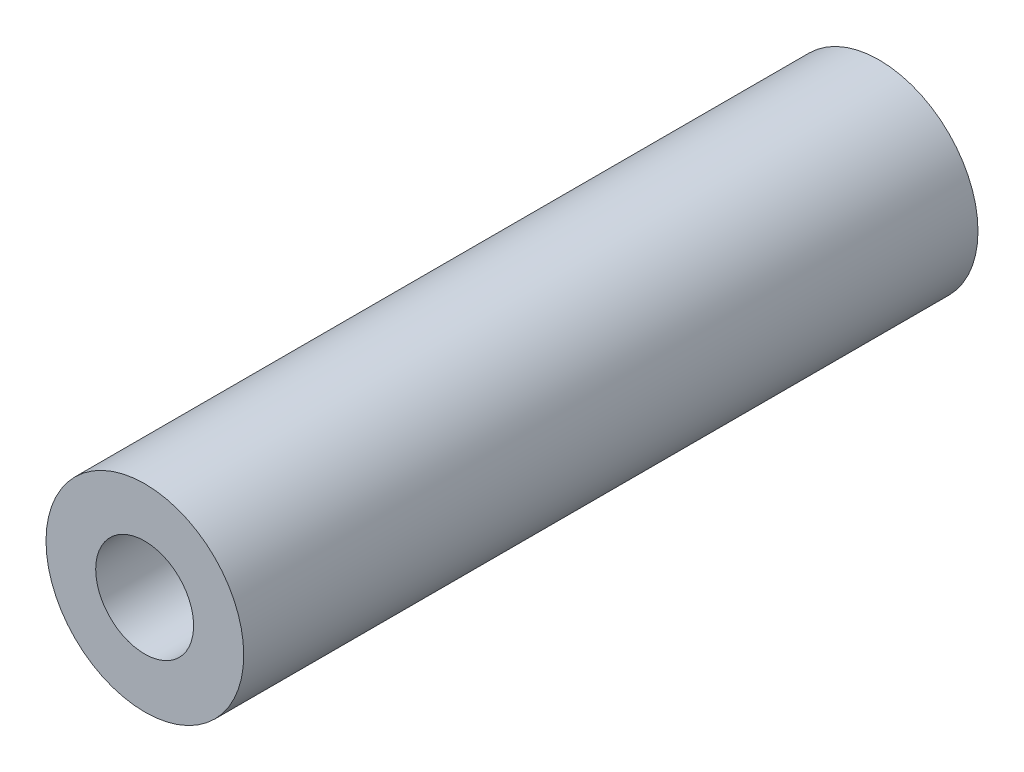
ISO-10303-21;
HEADER;
FILE_DESCRIPTION(('STEP AP214'),'2;1');
FILE_NAME('part.step','',(''),(''),'','','');
FILE_SCHEMA(('AUTOMOTIVE_DESIGN { 1 0 10303 214 1 1 1 1 }'));
ENDSEC;
DATA;
#1=APPLICATION_CONTEXT('core data for automotive mechanical design processes');
#2=APPLICATION_PROTOCOL_DEFINITION('international standard','automotive_design',2000,#1);
#3=PRODUCT_CONTEXT('',#1,'mechanical');
#4=PRODUCT('Part','Part','',(#3));
#5=PRODUCT_RELATED_PRODUCT_CATEGORY('part','',(#4));
#6=PRODUCT_DEFINITION_FORMATION('','',#4);
#7=PRODUCT_DEFINITION_CONTEXT('part definition',#1,'design');
#8=PRODUCT_DEFINITION('design','',#6,#7);
#9=PRODUCT_DEFINITION_SHAPE('','',#8);
#10=(LENGTH_UNIT() NAMED_UNIT(*) SI_UNIT(.MILLI.,.METRE.));
#11=(NAMED_UNIT(*) PLANE_ANGLE_UNIT() SI_UNIT($,.RADIAN.));
#12=(NAMED_UNIT(*) SI_UNIT($,.STERADIAN.) SOLID_ANGLE_UNIT());
#13=UNCERTAINTY_MEASURE_WITH_UNIT(LENGTH_MEASURE(1.E-05),#10,'distance_accuracy_value','');
#14=(GEOMETRIC_REPRESENTATION_CONTEXT(3) GLOBAL_UNCERTAINTY_ASSIGNED_CONTEXT((#13)) GLOBAL_UNIT_ASSIGNED_CONTEXT((#10,
#11,#12)) REPRESENTATION_CONTEXT('',''));
#15=CARTESIAN_POINT('',(0.,0.,0.));
#16=DIRECTION('',(0.,0.,1.));
#17=DIRECTION('',(1.,0.,0.));
#18=AXIS2_PLACEMENT_3D('',#15,#16,#17);
#19=CARTESIAN_POINT('',(-0.10940306159668,0.0577452115676953,45.));
#20=DIRECTION('',(0.,0.,1.));
#21=DIRECTION('',(1.,0.,0.));
#22=AXIS2_PLACEMENT_3D('',#19,#20,#21);
#23=PLANE('',#22);
#24=CARTESIAN_POINT('',(-0.10940306159668,0.0577452115676953,45.));
#25=DIRECTION('',(0.,0.,1.));
#26=DIRECTION('',(1.,0.,0.));
#27=AXIS2_PLACEMENT_3D('',#24,#25,#26);
#28=CIRCLE('',#27,6.05922744338173);
#29=CARTESIAN_POINT('',(-6.16863050497841,0.0577452115676953,45.));
#30=VERTEX_POINT('',#29);
#31=EDGE_CURVE('E10',#30,#30,#28,.T.);
#32=ORIENTED_EDGE('',*,*,#31,.T.);
#33=EDGE_LOOP('',(#32));
#34=FACE_BOUND('',#33,.T.);
#35=CARTESIAN_POINT('',(-0.123031064837464,0.076111171122141,45.));
#36=DIRECTION('',(0.,0.,1.));
#37=DIRECTION('',(1.,0.,0.));
#38=AXIS2_PLACEMENT_3D('',#35,#36,#37);
#39=CIRCLE('',#38,3.);
#40=CARTESIAN_POINT('',(-3.12303106483746,0.076111171122141,45.));
#41=VERTEX_POINT('',#40);
#42=EDGE_CURVE('E43',#41,#41,#39,.T.);
#43=ORIENTED_EDGE('',*,*,#42,.F.);
#44=EDGE_LOOP('',(#43));
#45=FACE_BOUND('',#44,.T.);
#46=ADVANCED_FACE('F32',(#34,#45),#23,.T.);
#47=CARTESIAN_POINT('',(-0.10940306159668,0.0577452115676953,0.));
#48=DIRECTION('',(0.,0.,1.));
#49=DIRECTION('',(1.,0.,0.));
#50=AXIS2_PLACEMENT_3D('',#47,#48,#49);
#51=PLANE('',#50);
#52=CARTESIAN_POINT('',(-0.10940306159668,0.0577452115676953,0.));
#53=DIRECTION('',(0.,0.,1.));
#54=DIRECTION('',(1.,0.,0.));
#55=AXIS2_PLACEMENT_3D('',#52,#53,#54);
#56=CIRCLE('',#55,6.05922744338173);
#57=CARTESIAN_POINT('',(-6.16863050497841,0.0577452115676953,0.));
#58=VERTEX_POINT('',#57);
#59=EDGE_CURVE('E36',#58,#58,#56,.T.);
#60=ORIENTED_EDGE('',*,*,#59,.F.);
#61=EDGE_LOOP('',(#60));
#62=FACE_BOUND('',#61,.T.);
#63=CARTESIAN_POINT('',(-0.123031064837464,0.076111171122141,0.));
#64=DIRECTION('',(0.,0.,1.));
#65=DIRECTION('',(1.,0.,0.));
#66=AXIS2_PLACEMENT_3D('',#63,#64,#65);
#67=CIRCLE('',#66,3.);
#68=CARTESIAN_POINT('',(-3.12303106483746,0.076111171122141,0.));
#69=VERTEX_POINT('',#68);
#70=EDGE_CURVE('E45',#69,#69,#67,.T.);
#71=ORIENTED_EDGE('',*,*,#70,.T.);
#72=EDGE_LOOP('',(#71));
#73=FACE_BOUND('',#72,.T.);
#74=ADVANCED_FACE('F55',(#62,#73),#51,.F.);
#75=CARTESIAN_POINT('',(-0.10940306159668,0.0577452115676953,45.));
#76=DIRECTION('',(0.,0.,-1.));
#77=DIRECTION('',(-1.,0.,0.));
#78=AXIS2_PLACEMENT_3D('',#75,#76,#77);
#79=CYLINDRICAL_SURFACE('',#78,6.05922744338173);
#80=CARTESIAN_POINT('',(-6.16863050497841,0.0577452115676953,45.));
#81=CARTESIAN_POINT('',(-6.16863050497841,0.0577452115676953,44.53125));
#82=CARTESIAN_POINT('',(-6.16863050497841,0.0577452115676953,44.0625));
#83=CARTESIAN_POINT('',(-6.16863050497841,0.0577452115676953,43.125));
#84=CARTESIAN_POINT('',(-6.16863050497841,0.0577452115676953,42.65625));
#85=CARTESIAN_POINT('',(-6.16863050497841,0.0577452115676953,41.71875));
#86=CARTESIAN_POINT('',(-6.16863050497841,0.0577452115676953,41.25));
#87=CARTESIAN_POINT('',(-6.16863050497841,0.0577452115676953,40.3125));
#88=CARTESIAN_POINT('',(-6.16863050497841,0.0577452115676953,39.84375));
#89=CARTESIAN_POINT('',(-6.16863050497841,0.0577452115676953,38.90625));
#90=CARTESIAN_POINT('',(-6.16863050497841,0.0577452115676953,38.4375));
#91=CARTESIAN_POINT('',(-6.16863050497841,0.0577452115676953,37.5));
#92=CARTESIAN_POINT('',(-6.16863050497841,0.0577452115676953,37.03125));
#93=CARTESIAN_POINT('',(-6.16863050497841,0.0577452115676953,36.09375));
#94=CARTESIAN_POINT('',(-6.16863050497841,0.0577452115676953,35.625));
#95=CARTESIAN_POINT('',(-6.16863050497841,0.0577452115676953,34.6875));
#96=CARTESIAN_POINT('',(-6.16863050497841,0.0577452115676953,34.21875));
#97=CARTESIAN_POINT('',(-6.16863050497841,0.0577452115676953,33.28125));
#98=CARTESIAN_POINT('',(-6.16863050497841,0.0577452115676953,32.8125));
#99=CARTESIAN_POINT('',(-6.16863050497841,0.0577452115676953,31.875));
#100=CARTESIAN_POINT('',(-6.16863050497841,0.0577452115676953,31.40625));
#101=CARTESIAN_POINT('',(-6.16863050497841,0.0577452115676953,30.46875));
#102=CARTESIAN_POINT('',(-6.16863050497841,0.0577452115676953,30.));
#103=CARTESIAN_POINT('',(-6.16863050497841,0.0577452115676953,29.0625));
#104=CARTESIAN_POINT('',(-6.16863050497841,0.0577452115676953,28.59375));
#105=CARTESIAN_POINT('',(-6.16863050497841,0.0577452115676953,27.65625));
#106=CARTESIAN_POINT('',(-6.16863050497841,0.0577452115676953,27.1875));
#107=CARTESIAN_POINT('',(-6.16863050497841,0.0577452115676953,26.25));
#108=CARTESIAN_POINT('',(-6.16863050497841,0.0577452115676953,25.78125));
#109=CARTESIAN_POINT('',(-6.16863050497841,0.0577452115676953,24.84375));
#110=CARTESIAN_POINT('',(-6.16863050497841,0.0577452115676953,24.375));
#111=CARTESIAN_POINT('',(-6.16863050497841,0.0577452115676953,23.4375));
#112=CARTESIAN_POINT('',(-6.16863050497841,0.0577452115676953,22.96875));
#113=CARTESIAN_POINT('',(-6.16863050497841,0.0577452115676953,22.03125));
#114=CARTESIAN_POINT('',(-6.16863050497841,0.0577452115676953,21.5625));
#115=CARTESIAN_POINT('',(-6.16863050497841,0.0577452115676953,20.625));
#116=CARTESIAN_POINT('',(-6.16863050497841,0.0577452115676953,20.15625));
#117=CARTESIAN_POINT('',(-6.16863050497841,0.0577452115676953,19.21875));
#118=CARTESIAN_POINT('',(-6.16863050497841,0.0577452115676953,18.75));
#119=CARTESIAN_POINT('',(-6.16863050497841,0.0577452115676953,17.8125));
#120=CARTESIAN_POINT('',(-6.16863050497841,0.0577452115676953,17.34375));
#121=CARTESIAN_POINT('',(-6.16863050497841,0.0577452115676953,16.40625));
#122=CARTESIAN_POINT('',(-6.16863050497841,0.0577452115676953,15.9375));
#123=CARTESIAN_POINT('',(-6.16863050497841,0.0577452115676953,15.));
#124=CARTESIAN_POINT('',(-6.16863050497841,0.0577452115676953,14.53125));
#125=CARTESIAN_POINT('',(-6.16863050497841,0.0577452115676953,13.59375));
#126=CARTESIAN_POINT('',(-6.16863050497841,0.0577452115676953,13.125));
#127=CARTESIAN_POINT('',(-6.16863050497841,0.0577452115676953,12.1875));
#128=CARTESIAN_POINT('',(-6.16863050497841,0.0577452115676953,11.71875));
#129=CARTESIAN_POINT('',(-6.16863050497841,0.0577452115676953,10.78125));
#130=CARTESIAN_POINT('',(-6.16863050497841,0.0577452115676953,10.3125));
#131=CARTESIAN_POINT('',(-6.16863050497841,0.0577452115676953,9.37499999999999));
#132=CARTESIAN_POINT('',(-6.16863050497841,0.0577452115676953,8.90624999999999));
#133=CARTESIAN_POINT('',(-6.16863050497841,0.0577452115676953,7.96874999999999));
#134=CARTESIAN_POINT('',(-6.16863050497841,0.0577452115676953,7.5));
#135=CARTESIAN_POINT('',(-6.16863050497841,0.0577452115676953,6.56249999999999));
#136=CARTESIAN_POINT('',(-6.16863050497841,0.0577452115676953,6.09374999999999));
#137=CARTESIAN_POINT('',(-6.16863050497841,0.0577452115676953,5.15624999999999));
#138=CARTESIAN_POINT('',(-6.16863050497841,0.0577452115676953,4.68749999999999));
#139=CARTESIAN_POINT('',(-6.16863050497841,0.0577452115676953,3.74999999999999));
#140=CARTESIAN_POINT('',(-6.16863050497841,0.0577452115676953,3.28124999999999));
#141=CARTESIAN_POINT('',(-6.16863050497841,0.0577452115676953,2.34374999999999));
#142=CARTESIAN_POINT('',(-6.16863050497841,0.0577452115676953,1.87499999999999));
#143=CARTESIAN_POINT('',(-6.16863050497841,0.0577452115676953,0.937499999999992));
#144=CARTESIAN_POINT('',(-6.16863050497841,0.0577452115676953,0.468749999999993));
#145=CARTESIAN_POINT('',(-6.16863050497841,0.0577452115676953,0.));
#146=B_SPLINE_CURVE_WITH_KNOTS('',3,(#80,#81,#82,#83,#84,#85,#86,#87,#88,#89,#90,#91,#92,#93,
#94,#95,#96,#97,#98,#99,#100,#101,#102,#103,#104,#105,#106,#107,#108,#109,#110,#111,#112,#113,
#114,#115,#116,#117,#118,#119,#120,#121,#122,#123,#124,#125,#126,#127,#128,#129,#130,#131,#132,
#133,#134,#135,#136,#137,#138,#139,#140,#141,#142,#143,#144,#145),.UNSPECIFIED.,.F.,.F.,(4,2,2,
2,2,2,2,2,2,2,2,2,2,2,2,2,2,2,2,2,2,2,2,2,2,2,2,2,2,2,2,2,4),(0.,1.40625,2.8125,
4.21874999999999,5.625,7.03125,8.43749999999999,9.84375,11.25,12.65625,14.0625,15.46875,16.875,
18.28125,19.6875,21.09375,22.5,23.90625,25.3125,26.71875,28.125,29.53125,30.9375,32.34375,33.75,
35.15625,36.5625,37.96875,39.375,40.78125,42.1875,43.59375,45.),.UNSPECIFIED.);
#147=EDGE_CURVE('BSEAM34',#30,#58,#146,.T.);
#148=ORIENTED_EDGE('',*,*,#31,.F.);
#149=ORIENTED_EDGE('',*,*,#59,.T.);
#150=ORIENTED_EDGE('',*,*,#147,.T.);
#151=ORIENTED_EDGE('',*,*,#147,.F.);
#152=EDGE_LOOP('',(#148,#150,#149,#151));
#153=FACE_BOUND('',#152,.T.);
#154=ADVANCED_FACE('F34',(#153),#79,.T.);
#155=CARTESIAN_POINT('',(-0.123031064837464,0.076111171122141,45.));
#156=DIRECTION('',(0.,0.,-1.));
#157=DIRECTION('',(-1.,0.,0.));
#158=AXIS2_PLACEMENT_3D('',#155,#156,#157);
#159=CYLINDRICAL_SURFACE('',#158,3.);
#160=CARTESIAN_POINT('',(-3.12303106483746,0.076111171122141,45.));
#161=CARTESIAN_POINT('',(-3.12303106483746,0.076111171122141,44.53125));
#162=CARTESIAN_POINT('',(-3.12303106483746,0.076111171122141,44.0625));
#163=CARTESIAN_POINT('',(-3.12303106483746,0.076111171122141,43.125));
#164=CARTESIAN_POINT('',(-3.12303106483746,0.076111171122141,42.65625));
#165=CARTESIAN_POINT('',(-3.12303106483746,0.076111171122141,41.71875));
#166=CARTESIAN_POINT('',(-3.12303106483746,0.076111171122141,41.25));
#167=CARTESIAN_POINT('',(-3.12303106483746,0.076111171122141,40.3125));
#168=CARTESIAN_POINT('',(-3.12303106483746,0.076111171122141,39.84375));
#169=CARTESIAN_POINT('',(-3.12303106483746,0.076111171122141,38.90625));
#170=CARTESIAN_POINT('',(-3.12303106483746,0.076111171122141,38.4375));
#171=CARTESIAN_POINT('',(-3.12303106483746,0.076111171122141,37.5));
#172=CARTESIAN_POINT('',(-3.12303106483746,0.076111171122141,37.03125));
#173=CARTESIAN_POINT('',(-3.12303106483746,0.076111171122141,36.09375));
#174=CARTESIAN_POINT('',(-3.12303106483746,0.076111171122141,35.625));
#175=CARTESIAN_POINT('',(-3.12303106483746,0.076111171122141,34.6875));
#176=CARTESIAN_POINT('',(-3.12303106483746,0.076111171122141,34.21875));
#177=CARTESIAN_POINT('',(-3.12303106483746,0.076111171122141,33.28125));
#178=CARTESIAN_POINT('',(-3.12303106483746,0.076111171122141,32.8125));
#179=CARTESIAN_POINT('',(-3.12303106483746,0.076111171122141,31.875));
#180=CARTESIAN_POINT('',(-3.12303106483746,0.076111171122141,31.40625));
#181=CARTESIAN_POINT('',(-3.12303106483746,0.076111171122141,30.46875));
#182=CARTESIAN_POINT('',(-3.12303106483746,0.076111171122141,30.));
#183=CARTESIAN_POINT('',(-3.12303106483746,0.076111171122141,29.0625));
#184=CARTESIAN_POINT('',(-3.12303106483746,0.076111171122141,28.59375));
#185=CARTESIAN_POINT('',(-3.12303106483746,0.076111171122141,27.65625));
#186=CARTESIAN_POINT('',(-3.12303106483746,0.076111171122141,27.1875));
#187=CARTESIAN_POINT('',(-3.12303106483746,0.076111171122141,26.25));
#188=CARTESIAN_POINT('',(-3.12303106483746,0.076111171122141,25.78125));
#189=CARTESIAN_POINT('',(-3.12303106483746,0.076111171122141,24.84375));
#190=CARTESIAN_POINT('',(-3.12303106483746,0.076111171122141,24.375));
#191=CARTESIAN_POINT('',(-3.12303106483746,0.076111171122141,23.4375));
#192=CARTESIAN_POINT('',(-3.12303106483746,0.076111171122141,22.96875));
#193=CARTESIAN_POINT('',(-3.12303106483746,0.076111171122141,22.03125));
#194=CARTESIAN_POINT('',(-3.12303106483746,0.076111171122141,21.5625));
#195=CARTESIAN_POINT('',(-3.12303106483746,0.076111171122141,20.625));
#196=CARTESIAN_POINT('',(-3.12303106483746,0.076111171122141,20.15625));
#197=CARTESIAN_POINT('',(-3.12303106483746,0.076111171122141,19.21875));
#198=CARTESIAN_POINT('',(-3.12303106483746,0.076111171122141,18.75));
#199=CARTESIAN_POINT('',(-3.12303106483746,0.076111171122141,17.8125));
#200=CARTESIAN_POINT('',(-3.12303106483746,0.076111171122141,17.34375));
#201=CARTESIAN_POINT('',(-3.12303106483746,0.076111171122141,16.40625));
#202=CARTESIAN_POINT('',(-3.12303106483746,0.076111171122141,15.9375));
#203=CARTESIAN_POINT('',(-3.12303106483746,0.076111171122141,15.));
#204=CARTESIAN_POINT('',(-3.12303106483746,0.076111171122141,14.53125));
#205=CARTESIAN_POINT('',(-3.12303106483746,0.076111171122141,13.59375));
#206=CARTESIAN_POINT('',(-3.12303106483746,0.076111171122141,13.125));
#207=CARTESIAN_POINT('',(-3.12303106483746,0.076111171122141,12.1875));
#208=CARTESIAN_POINT('',(-3.12303106483746,0.076111171122141,11.71875));
#209=CARTESIAN_POINT('',(-3.12303106483746,0.076111171122141,10.78125));
#210=CARTESIAN_POINT('',(-3.12303106483746,0.076111171122141,10.3125));
#211=CARTESIAN_POINT('',(-3.12303106483746,0.076111171122141,9.375));
#212=CARTESIAN_POINT('',(-3.12303106483746,0.076111171122141,8.90625));
#213=CARTESIAN_POINT('',(-3.12303106483746,0.076111171122141,7.96874999999999));
#214=CARTESIAN_POINT('',(-3.12303106483746,0.076111171122141,7.5));
#215=CARTESIAN_POINT('',(-3.12303106483746,0.076111171122141,6.5625));
#216=CARTESIAN_POINT('',(-3.12303106483746,0.076111171122141,6.09375));
#217=CARTESIAN_POINT('',(-3.12303106483746,0.076111171122141,5.15625));
#218=CARTESIAN_POINT('',(-3.12303106483746,0.076111171122141,4.68749999999999));
#219=CARTESIAN_POINT('',(-3.12303106483746,0.076111171122141,3.74999999999999));
#220=CARTESIAN_POINT('',(-3.12303106483746,0.076111171122141,3.28124999999999));
#221=CARTESIAN_POINT('',(-3.12303106483746,0.076111171122141,2.34374999999999));
#222=CARTESIAN_POINT('',(-3.12303106483746,0.076111171122141,1.87499999999999));
#223=CARTESIAN_POINT('',(-3.12303106483746,0.076111171122141,0.937499999999992));
#224=CARTESIAN_POINT('',(-3.12303106483746,0.076111171122141,0.468749999999993));
#225=CARTESIAN_POINT('',(-3.12303106483746,0.076111171122141,0.));
#226=B_SPLINE_CURVE_WITH_KNOTS('',3,(#160,#161,#162,#163,#164,#165,#166,#167,#168,#169,#170,
#171,#172,#173,#174,#175,#176,#177,#178,#179,#180,#181,#182,#183,#184,#185,#186,#187,#188,#189,
#190,#191,#192,#193,#194,#195,#196,#197,#198,#199,#200,#201,#202,#203,#204,#205,#206,#207,#208,
#209,#210,#211,#212,#213,#214,#215,#216,#217,#218,#219,#220,#221,#222,#223,#224,#225),
.UNSPECIFIED.,.F.,.F.,(4,2,2,2,2,2,2,2,2,2,2,2,2,2,2,2,2,2,2,2,2,2,2,2,2,2,2,2,2,2,2,2,4),(0.,
1.40625,2.8125,4.21875000000001,5.62500000000001,7.03125,8.4375,9.84375000000001,11.25,12.65625,
14.0625,15.46875,16.875,18.28125,19.6875,21.09375,22.5,23.90625,25.3125,26.71875,28.125,
29.53125,30.9375,32.34375,33.75,35.15625,36.5625,37.96875,39.375,40.78125,42.1875,43.59375,45.),.UNSPECIFIED.);
#227=EDGE_CURVE('BSEAM51',#41,#69,#226,.T.);
#228=ORIENTED_EDGE('',*,*,#42,.T.);
#229=ORIENTED_EDGE('',*,*,#70,.F.);
#230=ORIENTED_EDGE('',*,*,#227,.T.);
#231=ORIENTED_EDGE('',*,*,#227,.F.);
#232=EDGE_LOOP('',(#228,#230,#229,#231));
#233=FACE_BOUND('',#232,.T.);
#234=ADVANCED_FACE('F51',(#233),#159,.F.);
#235=CLOSED_SHELL('',(#46,#74,#154,#234));
#236=MANIFOLD_SOLID_BREP('B2',#235);
#237=ADVANCED_BREP_SHAPE_REPRESENTATION('',(#18,#236),#14);
#238=SHAPE_DEFINITION_REPRESENTATION(#9,#237);
ENDSEC;
END-ISO-10303-21;
